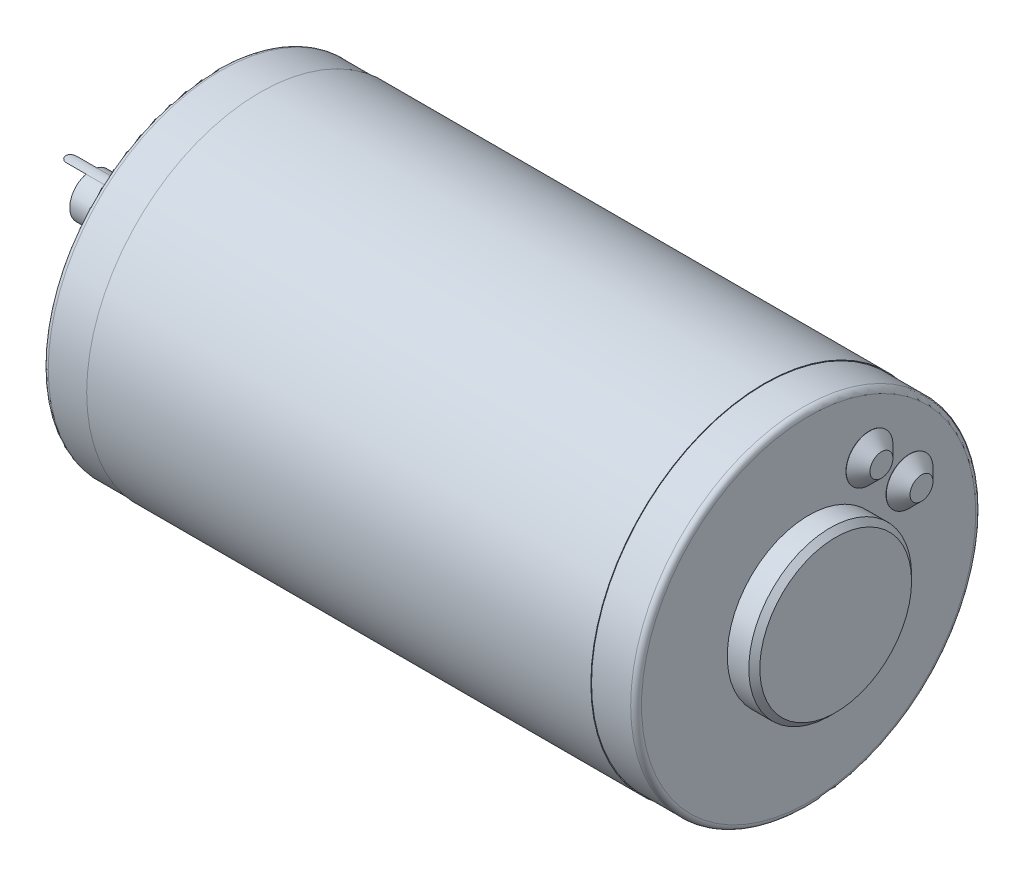
ISO-10303-21;
HEADER;
FILE_DESCRIPTION(('STEP AP214'),'2;1');
FILE_NAME('part.step','',(''),(''),'','','');
FILE_SCHEMA(('AUTOMOTIVE_DESIGN { 1 0 10303 214 1 1 1 1 }'));
ENDSEC;
DATA;
#1=APPLICATION_CONTEXT('core data for automotive mechanical design processes');
#2=APPLICATION_PROTOCOL_DEFINITION('international standard','automotive_design',2000,#1);
#3=PRODUCT_CONTEXT('',#1,'mechanical');
#4=PRODUCT('Part','Part','',(#3));
#5=PRODUCT_RELATED_PRODUCT_CATEGORY('part','',(#4));
#6=PRODUCT_DEFINITION_FORMATION('','',#4);
#7=PRODUCT_DEFINITION_CONTEXT('part definition',#1,'design');
#8=PRODUCT_DEFINITION('design','',#6,#7);
#9=PRODUCT_DEFINITION_SHAPE('','',#8);
#10=(LENGTH_UNIT() NAMED_UNIT(*) SI_UNIT(.MILLI.,.METRE.));
#11=(NAMED_UNIT(*) PLANE_ANGLE_UNIT() SI_UNIT($,.RADIAN.));
#12=(NAMED_UNIT(*) SI_UNIT($,.STERADIAN.) SOLID_ANGLE_UNIT());
#13=UNCERTAINTY_MEASURE_WITH_UNIT(LENGTH_MEASURE(1.E-05),#10,'distance_accuracy_value','');
#14=(GEOMETRIC_REPRESENTATION_CONTEXT(3) GLOBAL_UNCERTAINTY_ASSIGNED_CONTEXT((#13)) GLOBAL_UNIT_ASSIGNED_CONTEXT((#10,
#11,#12)) REPRESENTATION_CONTEXT('',''));
#15=CARTESIAN_POINT('',(0.,0.,0.));
#16=DIRECTION('',(0.,0.,1.));
#17=DIRECTION('',(1.,0.,0.));
#18=AXIS2_PLACEMENT_3D('',#15,#16,#17);
#19=CARTESIAN_POINT('',(-35.6,0.,0.));
#20=DIRECTION('',(1.,0.,0.));
#21=DIRECTION('',(0.,0.,-1.));
#22=AXIS2_PLACEMENT_3D('',#19,#20,#21);
#23=CYLINDRICAL_SURFACE('',#22,4.);
#24=CARTESIAN_POINT('',(-4.,0.,0.));
#25=DIRECTION('',(-1.,0.,0.));
#26=DIRECTION('',(0.,0.,1.));
#27=AXIS2_PLACEMENT_3D('',#24,#25,#26);
#28=CIRCLE('',#27,4.);
#29=CARTESIAN_POINT('',(-4.,0.,4.));
#30=VERTEX_POINT('',#29);
#31=EDGE_CURVE('P0_E121',#30,#30,#28,.T.);
#32=ORIENTED_EDGE('',*,*,#31,.T.);
#33=EDGE_LOOP('',(#32));
#34=FACE_BOUND('',#33,.T.);
#35=CARTESIAN_POINT('',(-22.9,0.,0.));
#36=DIRECTION('',(-1.,0.,0.));
#37=DIRECTION('',(0.,0.,1.));
#38=AXIS2_PLACEMENT_3D('',#35,#36,#37);
#39=CIRCLE('',#38,4.);
#40=CARTESIAN_POINT('',(-22.9,3.87298334620741,-1.));
#41=VERTEX_POINT('',#40);
#42=CARTESIAN_POINT('',(-22.9,3.87298334620741,1.));
#43=VERTEX_POINT('',#42);
#44=EDGE_CURVE('P0_E115',#41,#43,#39,.T.);
#45=ORIENTED_EDGE('',*,*,#44,.F.);
#46=DIRECTION('',(1.,0.,0.));
#47=VECTOR('',#46,1.);
#48=CARTESIAN_POINT('',(0.,3.87298334620741,-1.));
#49=LINE('',#48,#47);
#50=CARTESIAN_POINT('',(-7.1,3.87298334620741,-1.));
#51=VERTEX_POINT('',#50);
#52=EDGE_CURVE('P0_E113',#41,#51,#49,.T.);
#53=ORIENTED_EDGE('',*,*,#52,.T.);
#54=CARTESIAN_POINT('',(-7.1,3.87298334620741,-1.));
#55=CARTESIAN_POINT('',(-7.07233701489346,3.87298148580177,-1.00000033749611));
#56=CARTESIAN_POINT('',(-7.04468773698177,3.8732800994947,-0.998851407375366));
#57=CARTESIAN_POINT('',(-6.98959596469644,3.87445904774558,-0.994271295395754));
#58=CARTESIAN_POINT('',(-6.96215343631291,3.87533928441687,-0.990840497572679));
#59=CARTESIAN_POINT('',(-6.88054682679116,3.87881710972053,-0.977175239382526));
#60=CARTESIAN_POINT('',(-6.82694353151779,3.88225203148808,-0.963567695172493));
#61=CARTESIAN_POINT('',(-6.72287532621804,3.89095422588002,-0.927798076247997));
#62=CARTESIAN_POINT('',(-6.67241012178714,3.89622132630929,-0.905636805423836));
#63=CARTESIAN_POINT('',(-6.57588855135267,3.90799134471939,-0.853415378025865));
#64=CARTESIAN_POINT('',(-6.52983337210904,3.91449459395647,-0.823353103356933));
#65=CARTESIAN_POINT('',(-6.4424561180939,3.92816262398025,-0.755484471828069));
#66=CARTESIAN_POINT('',(-6.40124511375448,3.93533791028915,-0.717537268783976));
#67=CARTESIAN_POINT('',(-6.32569791051729,3.94945104396193,-0.63527578051623));
#68=CARTESIAN_POINT('',(-6.29136281053206,3.95638885322537,-0.590960479478831));
#69=CARTESIAN_POINT('',(-6.23008899838136,3.96936182283248,-0.496456899401691));
#70=CARTESIAN_POINT('',(-6.20326010401603,3.9753830468173,-0.446195340334474));
#71=CARTESIAN_POINT('',(-6.1584752658033,3.98572346250588,-0.341702590842919));
#72=CARTESIAN_POINT('',(-6.14051757570017,3.990042989147,-0.28747218408301));
#73=CARTESIAN_POINT('',(-6.11434100722257,3.99641900005128,-0.17774410852516));
#74=CARTESIAN_POINT('',(-6.10593232757718,3.998519529013,-0.122294322002858));
#75=CARTESIAN_POINT('',(-6.09849662845671,4.00037438150815,-0.0107327756816796));
#76=CARTESIAN_POINT('',(-6.09946842980766,4.00012899993444,0.0453789000287057));
#77=CARTESIAN_POINT('',(-6.11062996368545,3.99735237365735,0.155352492972096));
#78=CARTESIAN_POINT('',(-6.12061461659948,3.9948719867736,0.209236701739855));
#79=CARTESIAN_POINT('',(-6.14918867918275,3.98796330636495,0.31453871108434));
#80=CARTESIAN_POINT('',(-6.16777846956858,3.98353492665556,0.365956402423988));
#81=CARTESIAN_POINT('',(-6.21320128067065,3.97314997761798,0.465407286024539));
#82=CARTESIAN_POINT('',(-6.24010739423284,3.96717993827555,0.513405629602248));
#83=CARTESIAN_POINT('',(-6.30134312983347,3.95435945541919,0.604276631230014));
#84=CARTESIAN_POINT('',(-6.33567387025322,3.94750887933198,0.647148515562289));
#85=CARTESIAN_POINT('',(-6.41187891208131,3.93345566022865,0.72776938970849));
#86=CARTESIAN_POINT('',(-6.45393163653981,3.92624850477685,0.765349103054127));
#87=CARTESIAN_POINT('',(-6.54382986692773,3.91246168284006,0.832969575186237));
#88=CARTESIAN_POINT('',(-6.59167695328356,3.90588218842993,0.863008270245062));
#89=CARTESIAN_POINT('',(-6.69214559782377,3.89407813586325,0.914804709285962));
#90=CARTESIAN_POINT('',(-6.74479146489609,3.88886106009136,0.936517017887269));
#91=CARTESIAN_POINT('',(-6.85311692841829,3.88047058807055,0.970702351849829));
#92=CARTESIAN_POINT('',(-6.90879185514984,3.87729413761435,0.983189189212132));
#93=CARTESIAN_POINT('',(-6.9874573807589,3.87455290681524,0.993904635150938));
#94=CARTESIAN_POINT('',(-7.00991970321318,3.87396523110859,0.996190790966708));
#95=CARTESIAN_POINT('',(-7.05491778990932,3.87318062488974,0.999236757697394));
#96=CARTESIAN_POINT('',(-7.07745337595529,3.87298306219461,0.999999038096045));
#97=CARTESIAN_POINT('',(-7.1,3.87298334620741,1.));
#98=B_SPLINE_CURVE_WITH_KNOTS('',3,(#54,#55,#56,#57,#58,#59,#60,#61,#62,#63,#64,#65,#66,#67,#68,
#69,#70,#71,#72,#73,#74,#75,#76,#77,#78,#79,#80,#81,#82,#83,#84,#85,#86,#87,#88,#89,#90,#91,#92,
#93,#94,#95,#96,#97),.UNSPECIFIED.,.F.,.F.,(4,2,2,2,2,2,2,2,2,2,2,2,2,2,2,2,2,2,2,2,2,4),(0.,
0.0829365303397693,0.165859106084651,0.331229963080317,0.496585282091498,0.661984974726749,
0.830641897427974,0.999325753539193,1.17036187098235,1.34136430732424,1.50890481515325,
1.67642426256639,1.84022545479276,2.00403389475838,2.16932509450376,2.33464120964329,
2.50441429534542,2.67423379180967,2.84496720161068,3.01544447539986,3.08315848722648,
3.15076267731671),.UNSPECIFIED.);
#99=CARTESIAN_POINT('',(-7.1,3.87298334620741,1.));
#100=VERTEX_POINT('',#99);
#101=EDGE_CURVE('P0_E142',#51,#100,#98,.T.);
#102=ORIENTED_EDGE('',*,*,#101,.T.);
#103=DIRECTION('',(1.,0.,0.));
#104=VECTOR('',#103,1.);
#105=CARTESIAN_POINT('',(0.,3.87298334620741,1.));
#106=LINE('',#105,#104);
#107=EDGE_CURVE('P0_E138',#100,#43,#106,.F.);
#108=ORIENTED_EDGE('',*,*,#107,.T.);
#109=EDGE_LOOP('',(#45,#53,#102,#108));
#110=FACE_BOUND('',#109,.T.);
#111=ADVANCED_FACE('P0_F44',(#34,#110),#23,.T.);
#112=CARTESIAN_POINT('',(-26.6,32.005,-1.));
#113=DIRECTION('',(0.,0.,-1.));
#114=DIRECTION('',(-1.,0.,0.));
#115=AXIS2_PLACEMENT_3D('',#112,#113,#114);
#116=PLANE('',#115);
#117=DIRECTION('',(0.,1.,0.));
#118=VECTOR('',#117,1.);
#119=CARTESIAN_POINT('',(-22.9,32.005,-1.));
#120=LINE('',#119,#118);
#121=CARTESIAN_POINT('',(-22.9,2.79999999999999,-1.));
#122=VERTEX_POINT('',#121);
#123=EDGE_CURVE('P0_E101',#122,#41,#120,.T.);
#124=ORIENTED_EDGE('',*,*,#123,.F.);
#125=DIRECTION('',(1.,0.,0.));
#126=VECTOR('',#125,1.);
#127=CARTESIAN_POINT('',(-26.6,2.79999999999999,-1.));
#128=LINE('',#127,#126);
#129=CARTESIAN_POINT('',(-7.1,2.79999999999999,-1.));
#130=VERTEX_POINT('',#129);
#131=EDGE_CURVE('P0_E111',#122,#130,#128,.T.);
#132=ORIENTED_EDGE('',*,*,#131,.T.);
#133=DIRECTION('',(0.,-1.,0.));
#134=VECTOR('',#133,1.);
#135=CARTESIAN_POINT('',(-7.1,32.005,-1.));
#136=LINE('',#135,#134);
#137=EDGE_CURVE('P0_E141',#51,#130,#136,.T.);
#138=ORIENTED_EDGE('',*,*,#137,.F.);
#139=ORIENTED_EDGE('',*,*,#52,.F.);
#140=EDGE_LOOP('',(#124,#132,#138,#139));
#141=FACE_BOUND('',#140,.T.);
#142=ADVANCED_FACE('P0_F109',(#141),#116,.F.);
#143=CARTESIAN_POINT('',(-7.1,32.005,1.));
#144=DIRECTION('',(0.,0.,1.));
#145=DIRECTION('',(1.,0.,0.));
#146=AXIS2_PLACEMENT_3D('',#143,#144,#145);
#147=PLANE('',#146);
#148=DIRECTION('',(0.,-1.,0.));
#149=VECTOR('',#148,1.);
#150=CARTESIAN_POINT('',(-22.9,32.005,1.));
#151=LINE('',#150,#149);
#152=CARTESIAN_POINT('',(-22.9,2.79999999999999,1.));
#153=VERTEX_POINT('',#152);
#154=EDGE_CURVE('P0_E62',#43,#153,#151,.T.);
#155=ORIENTED_EDGE('',*,*,#154,.F.);
#156=ORIENTED_EDGE('',*,*,#107,.F.);
#157=DIRECTION('',(0.,-1.,0.));
#158=VECTOR('',#157,1.);
#159=CARTESIAN_POINT('',(-7.1,32.005,1.));
#160=LINE('',#159,#158);
#161=CARTESIAN_POINT('',(-7.1,2.79999999999999,1.));
#162=VERTEX_POINT('',#161);
#163=EDGE_CURVE('P0_E71',#100,#162,#160,.T.);
#164=ORIENTED_EDGE('',*,*,#163,.T.);
#165=DIRECTION('',(-1.,0.,0.));
#166=VECTOR('',#165,1.);
#167=CARTESIAN_POINT('',(-7.1,2.79999999999999,1.));
#168=LINE('',#167,#166);
#169=EDGE_CURVE('P0_E122',#162,#153,#168,.T.);
#170=ORIENTED_EDGE('',*,*,#169,.T.);
#171=EDGE_LOOP('',(#155,#156,#164,#170));
#172=FACE_BOUND('',#171,.T.);
#173=ADVANCED_FACE('P0_F159',(#172),#147,.F.);
#174=CARTESIAN_POINT('',(-7.1,2.79999999999999,0.));
#175=DIRECTION('',(0.,-1.,0.));
#176=DIRECTION('',(0.,0.,-1.));
#177=AXIS2_PLACEMENT_3D('',#174,#175,#176);
#178=PLANE('',#177);
#179=DIRECTION('',(0.,0.,-1.));
#180=VECTOR('',#179,1.);
#181=CARTESIAN_POINT('',(-22.9,2.79999999999999,0.));
#182=LINE('',#181,#180);
#183=EDGE_CURVE('P0_E11',#153,#122,#182,.T.);
#184=ORIENTED_EDGE('',*,*,#183,.F.);
#185=ORIENTED_EDGE('',*,*,#169,.F.);
#186=CARTESIAN_POINT('',(-7.1,2.79999999999999,0.));
#187=DIRECTION('',(0.,-1.,0.));
#188=DIRECTION('',(0.,0.,-1.));
#189=AXIS2_PLACEMENT_3D('',#186,#187,#188);
#190=CIRCLE('',#189,1.);
#191=EDGE_CURVE('P0_E119',#130,#162,#190,.T.);
#192=ORIENTED_EDGE('',*,*,#191,.F.);
#193=ORIENTED_EDGE('',*,*,#131,.F.);
#194=EDGE_LOOP('',(#184,#185,#192,#193));
#195=FACE_BOUND('',#194,.T.);
#196=ADVANCED_FACE('P0_F118',(#195),#178,.F.);
#197=CARTESIAN_POINT('',(-4.,0.,0.));
#198=DIRECTION('',(-1.,0.,0.));
#199=DIRECTION('',(0.,0.,1.));
#200=AXIS2_PLACEMENT_3D('',#197,#198,#199);
#201=PLANE('',#200);
#202=CARTESIAN_POINT('',(-4.,0.,0.));
#203=DIRECTION('',(-1.,0.,0.));
#204=DIRECTION('',(0.,0.,1.));
#205=AXIS2_PLACEMENT_3D('',#202,#203,#204);
#206=CIRCLE('',#205,8.50900000000004);
#207=CARTESIAN_POINT('',(-4.,0.,8.50900000000004));
#208=VERTEX_POINT('',#207);
#209=EDGE_CURVE('P0_E287',#208,#208,#206,.T.);
#210=ORIENTED_EDGE('',*,*,#209,.T.);
#211=EDGE_LOOP('',(#210));
#212=FACE_BOUND('',#211,.T.);
#213=ORIENTED_EDGE('',*,*,#31,.F.);
#214=EDGE_LOOP('',(#213));
#215=FACE_BOUND('',#214,.T.);
#216=ADVANCED_FACE('P0_F158',(#212,#215),#201,.T.);
#217=CARTESIAN_POINT('',(0.,0.,0.));
#218=DIRECTION('',(-1.,0.,0.));
#219=DIRECTION('',(0.,0.,1.));
#220=AXIS2_PLACEMENT_3D('',#217,#218,#219);
#221=PLANE('',#220);
#222=CARTESIAN_POINT('',(0.,0.,0.));
#223=DIRECTION('',(-1.,0.,0.));
#224=DIRECTION('',(0.,0.,1.));
#225=AXIS2_PLACEMENT_3D('',#222,#223,#224);
#226=CIRCLE('',#225,30.877);
#227=CARTESIAN_POINT('',(0.,0.,30.877));
#228=VERTEX_POINT('',#227);
#229=EDGE_CURVE('P0_E283',#228,#228,#226,.T.);
#230=ORIENTED_EDGE('',*,*,#229,.T.);
#231=EDGE_LOOP('',(#230));
#232=FACE_BOUND('',#231,.T.);
#233=CARTESIAN_POINT('',(0.,25.4,0.));
#234=DIRECTION('',(-1.,0.,0.));
#235=DIRECTION('',(0.,0.,1.));
#236=AXIS2_PLACEMENT_3D('',#233,#234,#235);
#237=CIRCLE('',#236,2.01929999999999);
#238=CARTESIAN_POINT('',(0.,25.4,2.01929999999999));
#239=VERTEX_POINT('',#238);
#240=EDGE_CURVE('P0_E304',#239,#239,#237,.T.);
#241=ORIENTED_EDGE('',*,*,#240,.F.);
#242=EDGE_LOOP('',(#241));
#243=FACE_BOUND('',#242,.T.);
#244=CARTESIAN_POINT('',(0.,-25.4,0.));
#245=DIRECTION('',(-1.,0.,0.));
#246=DIRECTION('',(0.,0.,1.));
#247=AXIS2_PLACEMENT_3D('',#244,#245,#246);
#248=CIRCLE('',#247,2.01929999999999);
#249=CARTESIAN_POINT('',(0.,-25.4,2.01929999999999));
#250=VERTEX_POINT('',#249);
#251=EDGE_CURVE('P0_E308',#250,#250,#248,.T.);
#252=ORIENTED_EDGE('',*,*,#251,.F.);
#253=EDGE_LOOP('',(#252));
#254=FACE_BOUND('',#253,.T.);
#255=CARTESIAN_POINT('',(0.,0.,0.));
#256=DIRECTION('',(-1.,0.,0.));
#257=DIRECTION('',(0.,0.,1.));
#258=AXIS2_PLACEMENT_3D('',#255,#256,#257);
#259=CIRCLE('',#258,9.525);
#260=CARTESIAN_POINT('',(0.,0.,9.525));
#261=VERTEX_POINT('',#260);
#262=EDGE_CURVE('P0_E128',#261,#261,#259,.T.);
#263=ORIENTED_EDGE('',*,*,#262,.F.);
#264=EDGE_LOOP('',(#263));
#265=FACE_BOUND('',#264,.T.);
#266=ADVANCED_FACE('P0_F220',(#232,#243,#254,#265),#221,.T.);
#267=CARTESIAN_POINT('',(8.2296,32.004,0.));
#268=DIRECTION('',(-1.,0.,0.));
#269=DIRECTION('',(0.,0.,1.));
#270=AXIS2_PLACEMENT_3D('',#267,#268,#269);
#271=PLANE('',#270);
#272=CARTESIAN_POINT('',(8.2296,0.,0.));
#273=DIRECTION('',(1.,0.,0.));
#274=DIRECTION('',(0.,0.,-1.));
#275=AXIS2_PLACEMENT_3D('',#272,#273,#274);
#276=CIRCLE('',#275,32.004);
#277=CARTESIAN_POINT('',(8.2296,0.,-32.004));
#278=VERTEX_POINT('',#277);
#279=EDGE_CURVE('P0_E341',#278,#278,#276,.T.);
#280=ORIENTED_EDGE('',*,*,#279,.F.);
#281=EDGE_LOOP('',(#280));
#282=FACE_BOUND('',#281,.T.);
#283=CARTESIAN_POINT('',(8.2296,0.,0.));
#284=DIRECTION('',(-1.,0.,0.));
#285=DIRECTION('',(0.,0.,1.));
#286=AXIS2_PLACEMENT_3D('',#283,#284,#285);
#287=CIRCLE('',#286,31.877);
#288=CARTESIAN_POINT('',(8.2296,0.,31.877));
#289=VERTEX_POINT('',#288);
#290=EDGE_CURVE('P0_E313',#289,#289,#287,.T.);
#291=ORIENTED_EDGE('',*,*,#290,.F.);
#292=EDGE_LOOP('',(#291));
#293=FACE_BOUND('',#292,.T.);
#294=ADVANCED_FACE('P0_F229',(#282,#293),#271,.T.);
#295=CARTESIAN_POINT('',(109.6,0.,0.));
#296=DIRECTION('',(1.,0.,0.));
#297=DIRECTION('',(0.,0.,-1.));
#298=AXIS2_PLACEMENT_3D('',#295,#296,#297);
#299=PLANE('',#298);
#300=CARTESIAN_POINT('',(109.6,0.,0.));
#301=DIRECTION('',(1.,0.,0.));
#302=DIRECTION('',(0.,0.,-1.));
#303=AXIS2_PLACEMENT_3D('',#300,#301,#302);
#304=CIRCLE('',#303,30.877);
#305=CARTESIAN_POINT('',(109.6,0.,-30.877));
#306=VERTEX_POINT('',#305);
#307=EDGE_CURVE('P0_E277',#306,#306,#304,.T.);
#308=ORIENTED_EDGE('',*,*,#307,.T.);
#309=EDGE_LOOP('',(#308));
#310=FACE_BOUND('',#309,.T.);
#311=CARTESIAN_POINT('',(109.6,18.6070906828553,-11.2073596390943));
#312=DIRECTION('',(1.,0.,0.));
#313=DIRECTION('',(0.,0.,-1.));
#314=AXIS2_PLACEMENT_3D('',#311,#312,#313);
#315=CIRCLE('',#314,4.318);
#316=CARTESIAN_POINT('',(109.6,18.6070906828553,-15.5253596390943));
#317=VERTEX_POINT('',#316);
#318=EDGE_CURVE('P0_E347',#317,#317,#315,.T.);
#319=ORIENTED_EDGE('',*,*,#318,.F.);
#320=EDGE_LOOP('',(#319));
#321=FACE_BOUND('',#320,.T.);
#322=CARTESIAN_POINT('',(109.6,11.2073596390943,-18.6070906828553));
#323=DIRECTION('',(1.,0.,0.));
#324=DIRECTION('',(0.,0.,-1.));
#325=AXIS2_PLACEMENT_3D('',#322,#323,#324);
#326=CIRCLE('',#325,4.318);
#327=CARTESIAN_POINT('',(109.6,11.2073596390943,-22.9250906828553));
#328=VERTEX_POINT('',#327);
#329=EDGE_CURVE('P0_E344',#328,#328,#326,.T.);
#330=ORIENTED_EDGE('',*,*,#329,.F.);
#331=EDGE_LOOP('',(#330));
#332=FACE_BOUND('',#331,.T.);
#333=CARTESIAN_POINT('',(109.6,0.,0.));
#334=DIRECTION('',(1.,0.,0.));
#335=DIRECTION('',(0.,0.,-1.));
#336=AXIS2_PLACEMENT_3D('',#333,#334,#335);
#337=CIRCLE('',#336,15.0368);
#338=CARTESIAN_POINT('',(109.6,0.,-15.0368));
#339=VERTEX_POINT('',#338);
#340=EDGE_CURVE('P0_E326',#339,#339,#337,.T.);
#341=ORIENTED_EDGE('',*,*,#340,.F.);
#342=EDGE_LOOP('',(#341));
#343=FACE_BOUND('',#342,.T.);
#344=ADVANCED_FACE('P0_F247',(#310,#321,#332,#343),#299,.T.);
#345=CARTESIAN_POINT('',(101.3704,0.,0.));
#346=DIRECTION('',(1.,0.,0.));
#347=DIRECTION('',(0.,0.,-1.));
#348=AXIS2_PLACEMENT_3D('',#345,#346,#347);
#349=PLANE('',#348);
#350=CARTESIAN_POINT('',(101.3704,0.,0.));
#351=DIRECTION('',(1.,0.,0.));
#352=DIRECTION('',(0.,0.,-1.));
#353=AXIS2_PLACEMENT_3D('',#350,#351,#352);
#354=CIRCLE('',#353,32.004);
#355=CARTESIAN_POINT('',(101.3704,0.,-32.004));
#356=VERTEX_POINT('',#355);
#357=EDGE_CURVE('P0_E338',#356,#356,#354,.T.);
#358=ORIENTED_EDGE('',*,*,#357,.T.);
#359=EDGE_LOOP('',(#358));
#360=FACE_BOUND('',#359,.T.);
#361=CARTESIAN_POINT('',(101.3704,0.,0.));
#362=DIRECTION('',(1.,0.,0.));
#363=DIRECTION('',(0.,0.,-1.));
#364=AXIS2_PLACEMENT_3D('',#361,#362,#363);
#365=CIRCLE('',#364,31.877);
#366=CARTESIAN_POINT('',(101.3704,0.,-31.877));
#367=VERTEX_POINT('',#366);
#368=EDGE_CURVE('P0_E331',#367,#367,#365,.T.);
#369=ORIENTED_EDGE('',*,*,#368,.F.);
#370=EDGE_LOOP('',(#369));
#371=FACE_BOUND('',#370,.T.);
#372=ADVANCED_FACE('P0_F250',(#360,#371),#349,.T.);
#373=CARTESIAN_POINT('',(8.2296,0.,0.));
#374=DIRECTION('',(1.,0.,0.));
#375=DIRECTION('',(0.,0.,-1.));
#376=AXIS2_PLACEMENT_3D('',#373,#374,#375);
#377=CYLINDRICAL_SURFACE('',#376,32.004);
#378=ORIENTED_EDGE('',*,*,#279,.T.);
#379=EDGE_LOOP('',(#378));
#380=FACE_BOUND('',#379,.T.);
#381=ORIENTED_EDGE('',*,*,#357,.F.);
#382=EDGE_LOOP('',(#381));
#383=FACE_BOUND('',#382,.T.);
#384=ADVANCED_FACE('P0_F254',(#380,#383),#377,.T.);
#385=CARTESIAN_POINT('',(109.6,0.,0.));
#386=DIRECTION('',(-1.,0.,0.));
#387=DIRECTION('',(0.,0.,1.));
#388=AXIS2_PLACEMENT_3D('',#385,#386,#387);
#389=CYLINDRICAL_SURFACE('',#388,31.877);
#390=CARTESIAN_POINT('',(108.6,0.,0.));
#391=DIRECTION('',(1.,0.,0.));
#392=DIRECTION('',(0.,0.,-1.));
#393=AXIS2_PLACEMENT_3D('',#390,#391,#392);
#394=CIRCLE('',#393,31.877);
#395=CARTESIAN_POINT('',(108.6,0.,-31.877));
#396=VERTEX_POINT('',#395);
#397=EDGE_CURVE('P0_E274',#396,#396,#394,.F.);
#398=ORIENTED_EDGE('',*,*,#397,.T.);
#399=EDGE_LOOP('',(#398));
#400=FACE_BOUND('',#399,.T.);
#401=ORIENTED_EDGE('',*,*,#368,.T.);
#402=EDGE_LOOP('',(#401));
#403=FACE_BOUND('',#402,.T.);
#404=ADVANCED_FACE('P0_F245',(#400,#403),#389,.T.);
#405=CARTESIAN_POINT('',(113.584,0.,0.));
#406=DIRECTION('',(-1.,0.,0.));
#407=DIRECTION('',(0.,0.,1.));
#408=AXIS2_PLACEMENT_3D('',#405,#406,#407);
#409=CYLINDRICAL_SURFACE('',#408,15.0368);
#410=CARTESIAN_POINT('',(113.584,0.,0.));
#411=DIRECTION('',(1.,0.,0.));
#412=DIRECTION('',(0.,0.,-1.));
#413=AXIS2_PLACEMENT_3D('',#410,#411,#412);
#414=CIRCLE('',#413,15.0368);
#415=CARTESIAN_POINT('',(113.584,0.,-15.0368));
#416=VERTEX_POINT('',#415);
#417=EDGE_CURVE('P0_E327',#416,#416,#414,.T.);
#418=ORIENTED_EDGE('',*,*,#417,.F.);
#419=EDGE_LOOP('',(#418));
#420=FACE_BOUND('',#419,.T.);
#421=ORIENTED_EDGE('',*,*,#340,.T.);
#422=EDGE_LOOP('',(#421));
#423=FACE_BOUND('',#422,.T.);
#424=ADVANCED_FACE('P0_F241',(#420,#423),#409,.T.);
#425=CARTESIAN_POINT('',(113.584,0.,0.));
#426=DIRECTION('',(-1.,0.,0.));
#427=DIRECTION('',(0.,0.,-1.));
#428=AXIS2_PLACEMENT_3D('',#425,#426,#427);
#429=CONICAL_SURFACE('',#428,15.0368,0.785398163397437);
#430=CARTESIAN_POINT('',(114.6,0.,0.));
#431=DIRECTION('',(1.,0.,0.));
#432=DIRECTION('',(0.,0.,-1.));
#433=AXIS2_PLACEMENT_3D('',#430,#431,#432);
#434=CIRCLE('',#433,14.0208);
#435=CARTESIAN_POINT('',(114.6,0.,-14.0208));
#436=VERTEX_POINT('',#435);
#437=EDGE_CURVE('P0_E319',#436,#436,#434,.T.);
#438=ORIENTED_EDGE('',*,*,#437,.F.);
#439=EDGE_LOOP('',(#438));
#440=FACE_BOUND('',#439,.T.);
#441=ORIENTED_EDGE('',*,*,#417,.T.);
#442=EDGE_LOOP('',(#441));
#443=FACE_BOUND('',#442,.T.);
#444=ADVANCED_FACE('P0_F237',(#440,#443),#429,.T.);
#445=CARTESIAN_POINT('',(114.6,0.,0.));
#446=DIRECTION('',(1.,0.,0.));
#447=DIRECTION('',(0.,0.,-1.));
#448=AXIS2_PLACEMENT_3D('',#445,#446,#447);
#449=PLANE('',#448);
#450=ORIENTED_EDGE('',*,*,#437,.T.);
#451=EDGE_LOOP('',(#450));
#452=FACE_BOUND('',#451,.T.);
#453=ADVANCED_FACE('P0_F233',(#452),#449,.T.);
#454=CARTESIAN_POINT('',(0.,0.,0.));
#455=DIRECTION('',(1.,0.,0.));
#456=DIRECTION('',(0.,0.,-1.));
#457=AXIS2_PLACEMENT_3D('',#454,#455,#456);
#458=CYLINDRICAL_SURFACE('',#457,31.877);
#459=CARTESIAN_POINT('',(0.999999999999998,0.,0.));
#460=DIRECTION('',(-1.,0.,0.));
#461=DIRECTION('',(0.,0.,1.));
#462=AXIS2_PLACEMENT_3D('',#459,#460,#461);
#463=CIRCLE('',#462,31.877);
#464=CARTESIAN_POINT('',(0.999999999999998,0.,31.877));
#465=VERTEX_POINT('',#464);
#466=EDGE_CURVE('P0_E53',#465,#465,#463,.F.);
#467=ORIENTED_EDGE('',*,*,#466,.T.);
#468=EDGE_LOOP('',(#467));
#469=FACE_BOUND('',#468,.T.);
#470=ORIENTED_EDGE('',*,*,#290,.T.);
#471=EDGE_LOOP('',(#470));
#472=FACE_BOUND('',#471,.T.);
#473=ADVANCED_FACE('P0_F225',(#469,#472),#458,.T.);
#474=CARTESIAN_POINT('',(-4.,0.,0.));
#475=DIRECTION('',(1.,0.,0.));
#476=DIRECTION('',(0.,0.,-1.));
#477=AXIS2_PLACEMENT_3D('',#474,#475,#476);
#478=CYLINDRICAL_SURFACE('',#477,9.525);
#479=CARTESIAN_POINT('',(-2.98400000000005,0.,0.));
#480=DIRECTION('',(-1.,0.,0.));
#481=DIRECTION('',(0.,0.,1.));
#482=AXIS2_PLACEMENT_3D('',#479,#480,#481);
#483=CIRCLE('',#482,9.525);
#484=CARTESIAN_POINT('',(-2.98400000000005,0.,9.525));
#485=VERTEX_POINT('',#484);
#486=EDGE_CURVE('P0_E279',#485,#485,#483,.F.);
#487=ORIENTED_EDGE('',*,*,#486,.T.);
#488=EDGE_LOOP('',(#487));
#489=FACE_BOUND('',#488,.T.);
#490=ORIENTED_EDGE('',*,*,#262,.T.);
#491=EDGE_LOOP('',(#490));
#492=FACE_BOUND('',#491,.T.);
#493=ADVANCED_FACE('P0_F222',(#489,#492),#478,.T.);
#494=CARTESIAN_POINT('',(-7.1,32.005,0.));
#495=DIRECTION('',(0.,-1.,0.));
#496=DIRECTION('',(0.,0.,-1.));
#497=AXIS2_PLACEMENT_3D('',#494,#495,#496);
#498=CYLINDRICAL_SURFACE('',#497,1.);
#499=ORIENTED_EDGE('',*,*,#101,.F.);
#500=ORIENTED_EDGE('',*,*,#137,.T.);
#501=ORIENTED_EDGE('',*,*,#191,.T.);
#502=ORIENTED_EDGE('',*,*,#163,.F.);
#503=EDGE_LOOP('',(#499,#500,#501,#502));
#504=FACE_BOUND('',#503,.T.);
#505=ADVANCED_FACE('P0_F164',(#504),#498,.F.);
#506=CARTESIAN_POINT('',(109.6,11.2073596390943,-18.6070906828553));
#507=DIRECTION('',(1.,0.,0.));
#508=DIRECTION('',(0.,0.,-1.));
#509=AXIS2_PLACEMENT_3D('',#506,#507,#508);
#510=CYLINDRICAL_SURFACE('',#509,4.318);
#511=ORIENTED_EDGE('',*,*,#329,.T.);
#512=EDGE_LOOP('',(#511));
#513=FACE_BOUND('',#512,.T.);
#514=CARTESIAN_POINT('',(109.6479,11.2073596390943,-18.6070906828553));
#515=DIRECTION('',(1.,0.,0.));
#516=DIRECTION('',(0.,0.,-1.));
#517=AXIS2_PLACEMENT_3D('',#514,#515,#516);
#518=CIRCLE('',#517,4.318);
#519=CARTESIAN_POINT('',(109.6479,11.2073596390943,-22.9250906828553));
#520=VERTEX_POINT('',#519);
#521=EDGE_CURVE('P0_E374',#520,#520,#518,.T.);
#522=ORIENTED_EDGE('',*,*,#521,.F.);
#523=EDGE_LOOP('',(#522));
#524=FACE_BOUND('',#523,.T.);
#525=ADVANCED_FACE('P0_F160',(#513,#524),#510,.T.);
#526=CARTESIAN_POINT('',(111.847899999964,11.2073596390943,-18.6070906828553));
#527=DIRECTION('',(1.,0.,0.));
#528=DIRECTION('',(0.,0.,-1.));
#529=AXIS2_PLACEMENT_3D('',#526,#527,#528);
#530=PLANE('',#529);
#531=CARTESIAN_POINT('',(111.847899999964,11.2073596390943,-18.6070906828553));
#532=DIRECTION('',(1.,0.,0.));
#533=DIRECTION('',(0.,0.,-1.));
#534=AXIS2_PLACEMENT_3D('',#531,#532,#533);
#535=CIRCLE('',#534,2.11800000003618);
#536=CARTESIAN_POINT('',(111.847899999964,11.2073596390943,-20.7250906828915));
#537=VERTEX_POINT('',#536);
#538=EDGE_CURVE('P0_E133',#537,#537,#535,.T.);
#539=ORIENTED_EDGE('',*,*,#538,.T.);
#540=EDGE_LOOP('',(#539));
#541=FACE_BOUND('',#540,.T.);
#542=ADVANCED_FACE('P0_F163',(#541),#530,.T.);
#543=CARTESIAN_POINT('',(111.847899999964,11.2073596390943,-18.6070906828553));
#544=DIRECTION('',(-1.,0.,0.));
#545=DIRECTION('',(0.,0.,1.));
#546=AXIS2_PLACEMENT_3D('',#543,#544,#545);
#547=CONICAL_SURFACE('',#546,2.11800000003618,0.78539816339745);
#548=ORIENTED_EDGE('',*,*,#521,.T.);
#549=EDGE_LOOP('',(#548));
#550=FACE_BOUND('',#549,.T.);
#551=ORIENTED_EDGE('',*,*,#538,.F.);
#552=EDGE_LOOP('',(#551));
#553=FACE_BOUND('',#552,.T.);
#554=ADVANCED_FACE('P0_F168',(#550,#553),#547,.T.);
#555=CARTESIAN_POINT('',(109.6,18.6070906828553,-11.2073596390943));
#556=DIRECTION('',(1.,0.,0.));
#557=DIRECTION('',(0.,0.,-1.));
#558=AXIS2_PLACEMENT_3D('',#555,#556,#557);
#559=CYLINDRICAL_SURFACE('',#558,4.318);
#560=ORIENTED_EDGE('',*,*,#318,.T.);
#561=EDGE_LOOP('',(#560));
#562=FACE_BOUND('',#561,.T.);
#563=CARTESIAN_POINT('',(109.6479,18.6070906828553,-11.2073596390943));
#564=DIRECTION('',(1.,0.,0.));
#565=DIRECTION('',(0.,0.,-1.));
#566=AXIS2_PLACEMENT_3D('',#563,#564,#565);
#567=CIRCLE('',#566,4.318);
#568=CARTESIAN_POINT('',(109.6479,18.6070906828553,-15.5253596390943));
#569=VERTEX_POINT('',#568);
#570=EDGE_CURVE('P0_E361',#569,#569,#567,.T.);
#571=ORIENTED_EDGE('',*,*,#570,.F.);
#572=EDGE_LOOP('',(#571));
#573=FACE_BOUND('',#572,.T.);
#574=ADVANCED_FACE('P0_F172',(#562,#573),#559,.T.);
#575=CARTESIAN_POINT('',(111.847899999949,18.6070906828553,-11.2073596390943));
#576=DIRECTION('',(1.,0.,0.));
#577=DIRECTION('',(0.,0.,-1.));
#578=AXIS2_PLACEMENT_3D('',#575,#576,#577);
#579=PLANE('',#578);
#580=CARTESIAN_POINT('',(111.847899999949,18.6070906828553,-11.2073596390943));
#581=DIRECTION('',(1.,0.,0.));
#582=DIRECTION('',(0.,0.,-1.));
#583=AXIS2_PLACEMENT_3D('',#580,#581,#582);
#584=CIRCLE('',#583,2.11800000005086);
#585=CARTESIAN_POINT('',(111.847899999949,18.6070906828553,-13.3253596391452));
#586=VERTEX_POINT('',#585);
#587=EDGE_CURVE('P0_E371',#586,#586,#584,.T.);
#588=ORIENTED_EDGE('',*,*,#587,.T.);
#589=EDGE_LOOP('',(#588));
#590=FACE_BOUND('',#589,.T.);
#591=ADVANCED_FACE('P0_F176',(#590),#579,.T.);
#592=CARTESIAN_POINT('',(111.847899999949,18.6070906828553,-11.2073596390943));
#593=DIRECTION('',(-1.,0.,0.));
#594=DIRECTION('',(0.,0.,1.));
#595=AXIS2_PLACEMENT_3D('',#592,#593,#594);
#596=CONICAL_SURFACE('',#595,2.11800000005086,0.785398163397448);
#597=ORIENTED_EDGE('',*,*,#570,.T.);
#598=EDGE_LOOP('',(#597));
#599=FACE_BOUND('',#598,.T.);
#600=ORIENTED_EDGE('',*,*,#587,.F.);
#601=EDGE_LOOP('',(#600));
#602=FACE_BOUND('',#601,.T.);
#603=ADVANCED_FACE('P0_F180',(#599,#602),#596,.T.);
#604=CARTESIAN_POINT('',(13.6144,-25.4,0.));
#605=DIRECTION('',(-1.,0.,0.));
#606=DIRECTION('',(0.,0.,1.));
#607=AXIS2_PLACEMENT_3D('',#604,#605,#606);
#608=CONICAL_SURFACE('',#607,2.01929999999999,1.02974425867198);
#609=CARTESIAN_POINT('',(14.8277178480152,-25.4,0.));
#610=VERTEX_POINT('',#609);
#611=VERTEX_LOOP('',#610);
#612=FACE_BOUND('',#611,.T.);
#613=CARTESIAN_POINT('',(13.6144,-25.4,0.));
#614=DIRECTION('',(-1.,0.,0.));
#615=DIRECTION('',(0.,0.,1.));
#616=AXIS2_PLACEMENT_3D('',#613,#614,#615);
#617=CIRCLE('',#616,2.01929999999999);
#618=CARTESIAN_POINT('',(13.6144,-25.4,2.01929999999999));
#619=VERTEX_POINT('',#618);
#620=EDGE_CURVE('P0_E356',#619,#619,#617,.T.);
#621=ORIENTED_EDGE('',*,*,#620,.T.);
#622=EDGE_LOOP('',(#621));
#623=FACE_BOUND('',#622,.T.);
#624=ADVANCED_FACE('P0_F184',(#612,#623),#608,.F.);
#625=CARTESIAN_POINT('',(0.,-25.4,0.));
#626=DIRECTION('',(-1.,0.,0.));
#627=DIRECTION('',(0.,0.,1.));
#628=AXIS2_PLACEMENT_3D('',#625,#626,#627);
#629=CYLINDRICAL_SURFACE('',#628,2.01929999999999);
#630=ORIENTED_EDGE('',*,*,#620,.F.);
#631=EDGE_LOOP('',(#630));
#632=FACE_BOUND('',#631,.T.);
#633=ORIENTED_EDGE('',*,*,#251,.T.);
#634=EDGE_LOOP('',(#633));
#635=FACE_BOUND('',#634,.T.);
#636=ADVANCED_FACE('P0_F188',(#632,#635),#629,.F.);
#637=CARTESIAN_POINT('',(13.6144,25.4,0.));
#638=DIRECTION('',(-1.,0.,0.));
#639=DIRECTION('',(0.,0.,1.));
#640=AXIS2_PLACEMENT_3D('',#637,#638,#639);
#641=CONICAL_SURFACE('',#640,2.01929999999999,1.02974425867198);
#642=CARTESIAN_POINT('',(14.8277178480152,25.4,0.));
#643=VERTEX_POINT('',#642);
#644=VERTEX_LOOP('',#643);
#645=FACE_BOUND('',#644,.T.);
#646=CARTESIAN_POINT('',(13.6144,25.4,0.));
#647=DIRECTION('',(-1.,0.,0.));
#648=DIRECTION('',(0.,0.,1.));
#649=AXIS2_PLACEMENT_3D('',#646,#647,#648);
#650=CIRCLE('',#649,2.01929999999999);
#651=CARTESIAN_POINT('',(13.6144,25.4,2.01929999999999));
#652=VERTEX_POINT('',#651);
#653=EDGE_CURVE('P0_E357',#652,#652,#650,.T.);
#654=ORIENTED_EDGE('',*,*,#653,.T.);
#655=EDGE_LOOP('',(#654));
#656=FACE_BOUND('',#655,.T.);
#657=ADVANCED_FACE('P0_F192',(#645,#656),#641,.F.);
#658=CARTESIAN_POINT('',(0.,25.4,0.));
#659=DIRECTION('',(-1.,0.,0.));
#660=DIRECTION('',(0.,0.,1.));
#661=AXIS2_PLACEMENT_3D('',#658,#659,#660);
#662=CYLINDRICAL_SURFACE('',#661,2.01929999999999);
#663=ORIENTED_EDGE('',*,*,#653,.F.);
#664=EDGE_LOOP('',(#663));
#665=FACE_BOUND('',#664,.T.);
#666=ORIENTED_EDGE('',*,*,#240,.T.);
#667=EDGE_LOOP('',(#666));
#668=FACE_BOUND('',#667,.T.);
#669=ADVANCED_FACE('P0_F196',(#665,#668),#662,.F.);
#670=CARTESIAN_POINT('',(-4.,0.,0.));
#671=DIRECTION('',(1.,0.,0.));
#672=DIRECTION('',(0.,0.,-1.));
#673=AXIS2_PLACEMENT_3D('',#670,#671,#672);
#674=CONICAL_SURFACE('',#673,8.50900000000004,0.785398163397452);
#675=ORIENTED_EDGE('',*,*,#486,.F.);
#676=EDGE_LOOP('',(#675));
#677=FACE_BOUND('',#676,.T.);
#678=ORIENTED_EDGE('',*,*,#209,.F.);
#679=EDGE_LOOP('',(#678));
#680=FACE_BOUND('',#679,.T.);
#681=ADVANCED_FACE('P0_F200',(#677,#680),#674,.T.);
#682=CARTESIAN_POINT('',(108.6,0.,0.));
#683=DIRECTION('',(1.,0.,0.));
#684=DIRECTION('',(0.,0.,-1.));
#685=AXIS2_PLACEMENT_3D('',#682,#683,#684);
#686=TOROIDAL_SURFACE('',#685,30.877,1.);
#687=ORIENTED_EDGE('',*,*,#397,.F.);
#688=EDGE_LOOP('',(#687));
#689=FACE_BOUND('',#688,.T.);
#690=ORIENTED_EDGE('',*,*,#307,.F.);
#691=EDGE_LOOP('',(#690));
#692=FACE_BOUND('',#691,.T.);
#693=ADVANCED_FACE('P0_F206',(#689,#692),#686,.T.);
#694=CARTESIAN_POINT('',(0.999999999999998,0.,0.));
#695=DIRECTION('',(-1.,0.,0.));
#696=DIRECTION('',(0.,0.,1.));
#697=AXIS2_PLACEMENT_3D('',#694,#695,#696);
#698=TOROIDAL_SURFACE('',#697,30.877,1.);
#699=ORIENTED_EDGE('',*,*,#466,.F.);
#700=EDGE_LOOP('',(#699));
#701=FACE_BOUND('',#700,.T.);
#702=ORIENTED_EDGE('',*,*,#229,.F.);
#703=EDGE_LOOP('',(#702));
#704=FACE_BOUND('',#703,.T.);
#705=ADVANCED_FACE('P0_F46',(#701,#704),#698,.T.);
#706=CARTESIAN_POINT('',(-22.9,-32.004,-24.176842268879));
#707=DIRECTION('',(-1.,0.,0.));
#708=DIRECTION('',(0.,0.,1.));
#709=AXIS2_PLACEMENT_3D('',#706,#707,#708);
#710=PLANE('',#709);
#711=ORIENTED_EDGE('',*,*,#44,.T.);
#712=ORIENTED_EDGE('',*,*,#154,.T.);
#713=ORIENTED_EDGE('',*,*,#183,.T.);
#714=ORIENTED_EDGE('',*,*,#123,.T.);
#715=EDGE_LOOP('',(#711,#712,#713,#714));
#716=FACE_BOUND('',#715,.T.);
#717=ADVANCED_FACE('P0_F100',(#716),#710,.T.);
#718=CLOSED_SHELL('',(#111,#142,#173,#196,#216,#266,#294,#344,#372,#384,#404,#424,#444,#453,
#473,#493,#505,#525,#542,#554,#574,#591,#603,#624,#636,#657,#669,#681,#693,#705,#717));
#719=MANIFOLD_SOLID_BREP('P0_B2',#718);
#720=CARTESIAN_POINT('',(0.,0.,0.));
#721=DIRECTION('',(1.,0.,0.));
#722=DIRECTION('',(0.,0.,-1.));
#723=AXIS2_PLACEMENT_3D('',#720,#721,#722);
#724=CYLINDRICAL_SURFACE('',#723,4.);
#725=DIRECTION('',(1.,0.,0.));
#726=VECTOR('',#725,1.);
#727=CARTESIAN_POINT('',(0.,3.87298334620741,1.));
#728=LINE('',#727,#726);
#729=CARTESIAN_POINT('',(-7.1,3.87298334620741,1.));
#730=VERTEX_POINT('',#729);
#731=CARTESIAN_POINT('',(-26.6,3.87298334620741,1.));
#732=VERTEX_POINT('',#731);
#733=EDGE_CURVE('P1_E34',#730,#732,#728,.F.);
#734=ORIENTED_EDGE('',*,*,#733,.F.);
#735=CARTESIAN_POINT('',(-7.1,3.87298334620741,-1.));
#736=CARTESIAN_POINT('',(-7.07233701489346,3.87298148580177,-1.00000033749611));
#737=CARTESIAN_POINT('',(-7.04468773698177,3.8732800994947,-0.998851407375366));
#738=CARTESIAN_POINT('',(-6.98959596469644,3.87445904774558,-0.994271295395754));
#739=CARTESIAN_POINT('',(-6.96215343631291,3.87533928441687,-0.990840497572679));
#740=CARTESIAN_POINT('',(-6.88054682679116,3.87881710972053,-0.977175239382526));
#741=CARTESIAN_POINT('',(-6.82694353151779,3.88225203148808,-0.963567695172493));
#742=CARTESIAN_POINT('',(-6.72287532621804,3.89095422588002,-0.927798076247997));
#743=CARTESIAN_POINT('',(-6.67241012178714,3.89622132630929,-0.905636805423836));
#744=CARTESIAN_POINT('',(-6.57588855135267,3.90799134471939,-0.853415378025865));
#745=CARTESIAN_POINT('',(-6.52983337210904,3.91449459395647,-0.823353103356933));
#746=CARTESIAN_POINT('',(-6.4424561180939,3.92816262398025,-0.755484471828069));
#747=CARTESIAN_POINT('',(-6.40124511375448,3.93533791028915,-0.717537268783976));
#748=CARTESIAN_POINT('',(-6.32569791051729,3.94945104396193,-0.63527578051623));
#749=CARTESIAN_POINT('',(-6.29136281053206,3.95638885322537,-0.590960479478831));
#750=CARTESIAN_POINT('',(-6.23008899838136,3.96936182283248,-0.496456899401691));
#751=CARTESIAN_POINT('',(-6.20326010401603,3.9753830468173,-0.446195340334474));
#752=CARTESIAN_POINT('',(-6.1584752658033,3.98572346250588,-0.341702590842919));
#753=CARTESIAN_POINT('',(-6.14051757570017,3.990042989147,-0.28747218408301));
#754=CARTESIAN_POINT('',(-6.11434100722257,3.99641900005128,-0.17774410852516));
#755=CARTESIAN_POINT('',(-6.10593232757718,3.998519529013,-0.122294322002858));
#756=CARTESIAN_POINT('',(-6.09849662845671,4.00037438150815,-0.0107327756816796));
#757=CARTESIAN_POINT('',(-6.09946842980766,4.00012899993444,0.0453789000287057));
#758=CARTESIAN_POINT('',(-6.11062996368545,3.99735237365735,0.155352492972096));
#759=CARTESIAN_POINT('',(-6.12061461659948,3.9948719867736,0.209236701739855));
#760=CARTESIAN_POINT('',(-6.14918867918275,3.98796330636495,0.31453871108434));
#761=CARTESIAN_POINT('',(-6.16777846956858,3.98353492665556,0.365956402423988));
#762=CARTESIAN_POINT('',(-6.21320128067065,3.97314997761798,0.465407286024539));
#763=CARTESIAN_POINT('',(-6.24010739423284,3.96717993827555,0.513405629602248));
#764=CARTESIAN_POINT('',(-6.30134312983347,3.95435945541919,0.604276631230014));
#765=CARTESIAN_POINT('',(-6.33567387025322,3.94750887933198,0.647148515562289));
#766=CARTESIAN_POINT('',(-6.41187891208131,3.93345566022865,0.72776938970849));
#767=CARTESIAN_POINT('',(-6.45393163653981,3.92624850477685,0.765349103054127));
#768=CARTESIAN_POINT('',(-6.54382986692773,3.91246168284006,0.832969575186237));
#769=CARTESIAN_POINT('',(-6.59167695328356,3.90588218842993,0.863008270245062));
#770=CARTESIAN_POINT('',(-6.69214559782377,3.89407813586325,0.914804709285962));
#771=CARTESIAN_POINT('',(-6.74479146489609,3.88886106009136,0.936517017887269));
#772=CARTESIAN_POINT('',(-6.85311692841829,3.88047058807055,0.970702351849829));
#773=CARTESIAN_POINT('',(-6.90879185514984,3.87729413761435,0.983189189212132));
#774=CARTESIAN_POINT('',(-6.9874573807589,3.87455290681524,0.993904635150938));
#775=CARTESIAN_POINT('',(-7.00991970321318,3.87396523110859,0.996190790966708));
#776=CARTESIAN_POINT('',(-7.05491778990932,3.87318062488974,0.999236757697394));
#777=CARTESIAN_POINT('',(-7.07745337595529,3.87298306219461,0.999999038096045));
#778=CARTESIAN_POINT('',(-7.1,3.87298334620741,1.));
#779=B_SPLINE_CURVE_WITH_KNOTS('',3,(#735,#736,#737,#738,#739,#740,#741,#742,#743,#744,#745,
#746,#747,#748,#749,#750,#751,#752,#753,#754,#755,#756,#757,#758,#759,#760,#761,#762,#763,#764,
#765,#766,#767,#768,#769,#770,#771,#772,#773,#774,#775,#776,#777,#778),.UNSPECIFIED.,.F.,.F.,(4,
2,2,2,2,2,2,2,2,2,2,2,2,2,2,2,2,2,2,2,2,4),(0.,0.0829365303397693,0.165859106084651,
0.331229963080317,0.496585282091498,0.661984974726749,0.830641897427974,0.999325753539193,
1.17036187098235,1.34136430732424,1.50890481515325,1.67642426256639,1.84022545479276,
2.00403389475838,2.16932509450376,2.33464120964329,2.50441429534542,2.67423379180967,
2.84496720161068,3.01544447539986,3.08315848722648,3.15076267731671),.UNSPECIFIED.);
#780=CARTESIAN_POINT('',(-7.1,3.87298334620741,-1.));
#781=VERTEX_POINT('',#780);
#782=EDGE_CURVE('P1_E46',#781,#730,#779,.T.);
#783=ORIENTED_EDGE('',*,*,#782,.F.);
#784=DIRECTION('',(1.,0.,0.));
#785=VECTOR('',#784,1.);
#786=CARTESIAN_POINT('',(0.,3.87298334620741,-1.));
#787=LINE('',#786,#785);
#788=CARTESIAN_POINT('',(-26.6,3.87298334620741,-1.));
#789=VERTEX_POINT('',#788);
#790=EDGE_CURVE('P1_E26',#789,#781,#787,.T.);
#791=ORIENTED_EDGE('',*,*,#790,.F.);
#792=CARTESIAN_POINT('',(-26.6,3.87298334620741,1.));
#793=CARTESIAN_POINT('',(-26.6276629851065,3.87298148580177,1.00000033749611));
#794=CARTESIAN_POINT('',(-26.6553122630182,3.8732800994947,0.998851407375366));
#795=CARTESIAN_POINT('',(-26.7104040353036,3.87445904774558,0.994271295395754));
#796=CARTESIAN_POINT('',(-26.7378465636871,3.87533928441687,0.990840497572679));
#797=CARTESIAN_POINT('',(-26.8194531732088,3.87881710972053,0.977175239382526));
#798=CARTESIAN_POINT('',(-26.8730564684822,3.88225203148808,0.963567695172493));
#799=CARTESIAN_POINT('',(-26.977124673782,3.89095422588002,0.927798076247996));
#800=CARTESIAN_POINT('',(-27.0275898782129,3.89622132630929,0.905636805423835));
#801=CARTESIAN_POINT('',(-27.1241114486473,3.90799134471939,0.853415378025864));
#802=CARTESIAN_POINT('',(-27.170166627891,3.91449459395647,0.823353103356932));
#803=CARTESIAN_POINT('',(-27.2575438819061,3.92816262398025,0.755484471828069));
#804=CARTESIAN_POINT('',(-27.2987548862455,3.93533791028915,0.717537268783975));
#805=CARTESIAN_POINT('',(-27.3743020894827,3.94945104396193,0.635275780516229));
#806=CARTESIAN_POINT('',(-27.4086371894679,3.95638885322537,0.59096047947883));
#807=CARTESIAN_POINT('',(-27.4699110016186,3.96936182283248,0.496456899401689));
#808=CARTESIAN_POINT('',(-27.496739895984,3.9753830468173,0.446195340334472));
#809=CARTESIAN_POINT('',(-27.5415247341967,3.98572346250588,0.341702590842916));
#810=CARTESIAN_POINT('',(-27.5594824242998,3.990042989147,0.287472184083007));
#811=CARTESIAN_POINT('',(-27.5856589927774,3.99641900005128,0.177744108525158));
#812=CARTESIAN_POINT('',(-27.5940676724228,3.998519529013,0.122294322002856));
#813=CARTESIAN_POINT('',(-27.6015033715433,4.00037438150815,0.0107327756816781));
#814=CARTESIAN_POINT('',(-27.6005315701923,4.00012899993444,-0.0453789000287067));
#815=CARTESIAN_POINT('',(-27.5893700363146,3.99735237365735,-0.155352492972096));
#816=CARTESIAN_POINT('',(-27.5793853834005,3.9948719867736,-0.209236701739855));
#817=CARTESIAN_POINT('',(-27.5508113208173,3.98796330636495,-0.31453871108434));
#818=CARTESIAN_POINT('',(-27.5322215304314,3.98353492665556,-0.365956402423988));
#819=CARTESIAN_POINT('',(-27.4867987193294,3.97314997761798,-0.46540728602454));
#820=CARTESIAN_POINT('',(-27.4598926057672,3.96717993827555,-0.513405629602248));
#821=CARTESIAN_POINT('',(-27.3986568701665,3.95435945541919,-0.604276631230015));
#822=CARTESIAN_POINT('',(-27.3643261297468,3.94750887933198,-0.64714851556229));
#823=CARTESIAN_POINT('',(-27.2881210879187,3.93345566022865,-0.727769389708492));
#824=CARTESIAN_POINT('',(-27.2460683634602,3.92624850477685,-0.765349103054128));
#825=CARTESIAN_POINT('',(-27.1561701330723,3.91246168284006,-0.832969575186237));
#826=CARTESIAN_POINT('',(-27.1083230467164,3.90588218842993,-0.863008270245062));
#827=CARTESIAN_POINT('',(-27.0078544021762,3.89407813586325,-0.914804709285961));
#828=CARTESIAN_POINT('',(-26.9552085351039,3.88886106009136,-0.936517017887269));
#829=CARTESIAN_POINT('',(-26.8468830715817,3.88047058807054,-0.970702351849828));
#830=CARTESIAN_POINT('',(-26.7912081448502,3.87729413761435,-0.983189189212131));
#831=CARTESIAN_POINT('',(-26.7125426192411,3.87455290681524,-0.993904635150938));
#832=CARTESIAN_POINT('',(-26.6900802967868,3.87396523110859,-0.996190790966708));
#833=CARTESIAN_POINT('',(-26.6450822100907,3.87318062488974,-0.999236757697394));
#834=CARTESIAN_POINT('',(-26.6225466240447,3.87298306219461,-0.999999038096045));
#835=CARTESIAN_POINT('',(-26.6,3.87298334620741,-1.));
#836=B_SPLINE_CURVE_WITH_KNOTS('',3,(#792,#793,#794,#795,#796,#797,#798,#799,#800,#801,#802,
#803,#804,#805,#806,#807,#808,#809,#810,#811,#812,#813,#814,#815,#816,#817,#818,#819,#820,#821,
#822,#823,#824,#825,#826,#827,#828,#829,#830,#831,#832,#833,#834,#835),.UNSPECIFIED.,.F.,.F.,(4,
2,2,2,2,2,2,2,2,2,2,2,2,2,2,2,2,2,2,2,2,4),(0.,0.0829365303397727,0.165859106084653,
0.331229963080318,0.496585282091499,0.661984974726751,0.830641897427976,0.999325753539196,
1.17036187098235,1.34136430732425,1.50890481515325,1.67642426256639,1.84022545479276,
2.00403389475838,2.16932509450376,2.33464120964329,2.50441429534542,2.67423379180967,
2.84496720161068,3.01544447539986,3.08315848722649,3.15076267731671),.UNSPECIFIED.);
#837=EDGE_CURVE('P1_E11',#732,#789,#836,.T.);
#838=ORIENTED_EDGE('',*,*,#837,.F.);
#839=EDGE_LOOP('',(#734,#783,#791,#838));
#840=FACE_BOUND('',#839,.T.);
#841=ADVANCED_FACE('P1_F16',(#840),#724,.T.);
#842=OPEN_SHELL('',(#841));
#843=SHELL_BASED_SURFACE_MODEL('P1_B1',(#842));
#844=ADVANCED_BREP_SHAPE_REPRESENTATION('',(#18,#719),#14);
#845=MANIFOLD_SURFACE_SHAPE_REPRESENTATION('',(#18,#843),#14);
#846=SHAPE_REPRESENTATION('',(#18),#14);
#847=SHAPE_DEFINITION_REPRESENTATION(#9,#846);
#848=SHAPE_REPRESENTATION_RELATIONSHIP('','',#846,#844);
#849=SHAPE_REPRESENTATION_RELATIONSHIP('','',#846,#845);
ENDSEC;
END-ISO-10303-21;
